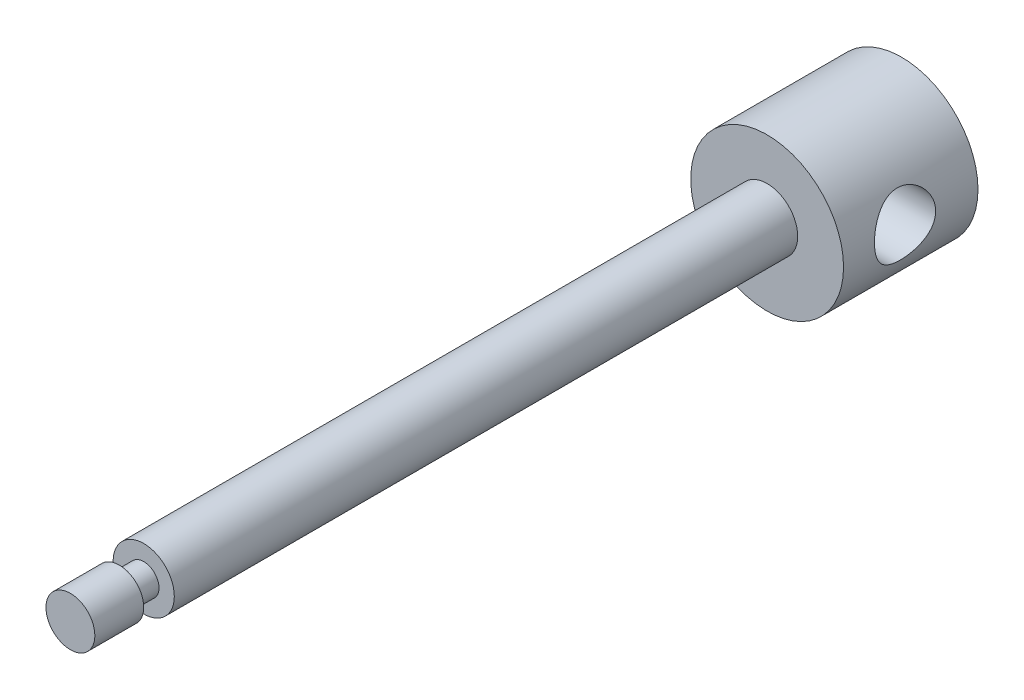
ISO-10303-21;
HEADER;
FILE_DESCRIPTION(('STEP AP214'),'2;1');
FILE_NAME('part.step','',(''),(''),'','','');
FILE_SCHEMA(('AUTOMOTIVE_DESIGN { 1 0 10303 214 1 1 1 1 }'));
ENDSEC;
DATA;
#1=APPLICATION_CONTEXT('core data for automotive mechanical design processes');
#2=APPLICATION_PROTOCOL_DEFINITION('international standard','automotive_design',2000,#1);
#3=PRODUCT_CONTEXT('',#1,'mechanical');
#4=PRODUCT('Part','Part','',(#3));
#5=PRODUCT_RELATED_PRODUCT_CATEGORY('part','',(#4));
#6=PRODUCT_DEFINITION_FORMATION('','',#4);
#7=PRODUCT_DEFINITION_CONTEXT('part definition',#1,'design');
#8=PRODUCT_DEFINITION('design','',#6,#7);
#9=PRODUCT_DEFINITION_SHAPE('','',#8);
#10=(LENGTH_UNIT() NAMED_UNIT(*) SI_UNIT(.MILLI.,.METRE.));
#11=(NAMED_UNIT(*) PLANE_ANGLE_UNIT() SI_UNIT($,.RADIAN.));
#12=(NAMED_UNIT(*) SI_UNIT($,.STERADIAN.) SOLID_ANGLE_UNIT());
#13=UNCERTAINTY_MEASURE_WITH_UNIT(LENGTH_MEASURE(1.E-05),#10,'distance_accuracy_value','');
#14=(GEOMETRIC_REPRESENTATION_CONTEXT(3) GLOBAL_UNCERTAINTY_ASSIGNED_CONTEXT((#13)) GLOBAL_UNIT_ASSIGNED_CONTEXT((#10,
#11,#12)) REPRESENTATION_CONTEXT('',''));
#15=CARTESIAN_POINT('',(0.,0.,0.));
#16=DIRECTION('',(0.,0.,1.));
#17=DIRECTION('',(1.,0.,0.));
#18=AXIS2_PLACEMENT_3D('',#15,#16,#17);
#19=CARTESIAN_POINT('',(0.,1.2144006816421,22.));
#20=DIRECTION('',(0.,0.,-1.));
#21=DIRECTION('',(-1.,0.,0.));
#22=AXIS2_PLACEMENT_3D('',#19,#20,#21);
#23=CYLINDRICAL_SURFACE('',#22,12.5);
#24=CARTESIAN_POINT('',(-12.5,1.2144006816421,16.8899728456725));
#25=CARTESIAN_POINT('',(-12.4999992543487,1.07970381947691,16.8753180214145));
#26=CARTESIAN_POINT('',(-12.4978168714077,0.945559437583658,16.8551780233001));
#27=CARTESIAN_POINT('',(-12.4892572103874,0.679420519037024,16.8040893931823));
#28=CARTESIAN_POINT('',(-12.4828772815054,0.547427394943417,16.7731339368785));
#29=CARTESIAN_POINT('',(-12.4661883417108,0.286342718644998,16.7006139648573));
#30=CARTESIAN_POINT('',(-12.4558711798495,0.157257778123743,16.659027499947));
#31=CARTESIAN_POINT('',(-12.4316887944545,-0.0968648537615797,16.5656247206657));
#32=CARTESIAN_POINT('',(-12.4178221150037,-0.221900860597329,16.5138042105606));
#33=CARTESIAN_POINT('',(-12.3870655572071,-0.466595937310872,16.4005817020329));
#34=CARTESIAN_POINT('',(-12.370187233703,-0.586273444805831,16.3392164357542));
#35=CARTESIAN_POINT('',(-12.3339006368527,-0.820031775175914,16.2072379512532));
#36=CARTESIAN_POINT('',(-12.3144914228805,-0.93411049541151,16.1366212946305));
#37=CARTESIAN_POINT('',(-12.2533474582745,-1.26675607116186,15.9117295740658));
#38=CARTESIAN_POINT('',(-12.208652474498,-1.47606182161835,15.7442594931762));
#39=CARTESIAN_POINT('',(-12.1144933895027,-1.87308263318599,15.3708612873472));
#40=CARTESIAN_POINT('',(-12.0649077458587,-2.05951851343006,15.1636113782832));
#41=CARTESIAN_POINT('',(-11.9685922328311,-2.39578346338789,14.720541004817));
#42=CARTESIAN_POINT('',(-11.9218631925961,-2.54560194212806,14.4847123039073));
#43=CARTESIAN_POINT('',(-11.8361585590568,-2.80739705581192,13.9843759736641));
#44=CARTESIAN_POINT('',(-11.797386587271,-2.91842148814866,13.7193324524758));
#45=CARTESIAN_POINT('',(-11.7345219013332,-3.09370617065158,13.172588533405));
#46=CARTESIAN_POINT('',(-11.7104214962755,-3.15799092542163,12.8908969476301));
#47=CARTESIAN_POINT('',(-11.6813484934652,-3.23506130041064,12.3344970595621));
#48=CARTESIAN_POINT('',(-11.6754501181057,-3.25034107160089,12.0601823680499));
#49=CARTESIAN_POINT('',(-11.6810000238143,-3.23580213959042,11.5129591441698));
#50=CARTESIAN_POINT('',(-11.6924454438434,-3.20599087462521,11.2400503873296));
#51=CARTESIAN_POINT('',(-11.7302972508769,-3.10449469387554,10.7139763114712));
#52=CARTESIAN_POINT('',(-11.756127122814,-3.0344202435973,10.4604543636527));
#53=CARTESIAN_POINT('',(-11.8190538505116,-2.85608377880052,9.96871057200854));
#54=CARTESIAN_POINT('',(-11.8561533123528,-2.74781293046959,9.73049228259078));
#55=CARTESIAN_POINT('',(-11.9390054613151,-2.49087859763256,9.26510561705903));
#56=CARTESIAN_POINT('',(-11.9850573309462,-2.34070287802891,9.0388282534172));
#57=CARTESIAN_POINT('',(-12.0793108517145,-2.00590599616643,8.61362354359353));
#58=CARTESIAN_POINT('',(-12.1275132279762,-1.82127314756042,8.41470551637429));
#59=CARTESIAN_POINT('',(-12.1984586063268,-1.51676546957542,8.13581426103148));
#60=CARTESIAN_POINT('',(-12.2224421582169,-1.4076630663148,8.04414393431453));
#61=CARTESIAN_POINT('',(-12.2687161072648,-1.18181882583956,7.87030240840149));
#62=CARTESIAN_POINT('',(-12.2910071336703,-1.06507985809609,7.78812767294267));
#63=CARTESIAN_POINT('',(-12.3331727535265,-0.824656134458093,7.63386944167571));
#64=CARTESIAN_POINT('',(-12.3530466273007,-0.700969325877917,7.56178895033816));
#65=CARTESIAN_POINT('',(-12.3896842776451,-0.447556158445703,7.42836578465004));
#66=CARTESIAN_POINT('',(-12.4064494664899,-0.317832575771491,7.36701823504627));
#67=CARTESIAN_POINT('',(-12.4359400513605,-0.0561667725580191,7.2568156000918));
#68=CARTESIAN_POINT('',(-12.4487469734508,0.075662006334584,7.2077131046694));
#69=CARTESIAN_POINT('',(-12.4703279443051,0.343237555846937,7.12073547773425));
#70=CARTESIAN_POINT('',(-12.4791037231353,0.478982619060347,7.08285553226539));
#71=CARTESIAN_POINT('',(-12.4922499824094,0.753368100817096,7.01866403176222));
#72=CARTESIAN_POINT('',(-12.4966212370216,0.89200800616972,6.99235044420714));
#73=CARTESIAN_POINT('',(-12.50070371425,1.17108133789882,6.95153263599886));
#74=CARTESIAN_POINT('',(-12.500415169195,1.31151467450941,6.93702782662035));
#75=CARTESIAN_POINT('',(-12.4952183282181,1.5845940124757,6.92045324196236));
#76=CARTESIAN_POINT('',(-12.4905871165559,1.71720390489807,6.91769220123804));
#77=CARTESIAN_POINT('',(-12.4771107389808,1.98205556301086,6.92269584995318));
#78=CARTESIAN_POINT('',(-12.4682641644522,2.1142971907722,6.93046405947388));
#79=CARTESIAN_POINT('',(-12.4464830956314,2.377358740916,6.95640541411579));
#80=CARTESIAN_POINT('',(-12.4335502458241,2.50817921336056,6.9745743759312));
#81=CARTESIAN_POINT('',(-12.4038157163494,2.7675945886164,7.02110156005534));
#82=CARTESIAN_POINT('',(-12.3870125719208,2.89618862894537,7.0494636423604));
#83=CARTESIAN_POINT('',(-12.3499585845912,3.14955323715043,7.1158929291709));
#84=CARTESIAN_POINT('',(-12.329727591897,3.27434119434542,7.1539048510415));
#85=CARTESIAN_POINT('',(-12.2861446035363,3.52010285733278,7.23934965307657));
#86=CARTESIAN_POINT('',(-12.2627915014273,3.64107519203788,7.2867858760237));
#87=CARTESIAN_POINT('',(-12.1887135299152,3.99717833211625,7.44265005585548));
#88=CARTESIAN_POINT('',(-12.1339419470369,4.22568072220083,7.56468266041247));
#89=CARTESIAN_POINT('',(-12.0142101164943,4.67358984016639,7.8501666895856));
#90=CARTESIAN_POINT('',(-11.9488251632607,4.89151421358886,8.01574480225269));
#91=CARTESIAN_POINT('',(-11.8162719974036,5.29745189927118,8.3800192282329));
#92=CARTESIAN_POINT('',(-11.749102860377,5.48544933891501,8.57873300236701));
#93=CARTESIAN_POINT('',(-11.6498498276669,5.74655158723661,8.90437920160379));
#94=CARTESIAN_POINT('',(-11.6161336379803,5.83208296557064,9.0210705960629));
#95=CARTESIAN_POINT('',(-11.5508863826612,5.99295080098725,9.26183773717309));
#96=CARTESIAN_POINT('',(-11.519354457925,6.06829127753823,9.38591054450194));
#97=CARTESIAN_POINT('',(-11.4594056237413,6.20817910519431,9.64074612614563));
#98=CARTESIAN_POINT('',(-11.4309892970661,6.27272443825083,9.77151014536492));
#99=CARTESIAN_POINT('',(-11.3782055857783,6.39036384690228,10.0388099837069));
#100=CARTESIAN_POINT('',(-11.353836105586,6.44346385350496,10.1753427693489));
#101=CARTESIAN_POINT('',(-11.3108428453994,6.5358034708544,10.4477807262017));
#102=CARTESIAN_POINT('',(-11.2920306029223,6.57550652854048,10.5834989100717));
#103=CARTESIAN_POINT('',(-11.2595685078235,6.64335403538527,10.8583385391385));
#104=CARTESIAN_POINT('',(-11.2459161398122,6.67150411708612,10.9974582907947));
#105=CARTESIAN_POINT('',(-11.2242671202821,6.71589497837488,11.2779562457106));
#106=CARTESIAN_POINT('',(-11.2162677919505,6.73214139469014,11.419333347601));
#107=CARTESIAN_POINT('',(-11.2062210068887,6.7525179666537,11.7031643684367));
#108=CARTESIAN_POINT('',(-11.204173050475,6.75664913951073,11.845618195972));
#109=CARTESIAN_POINT('',(-11.2060131883828,6.75292629893702,12.1167826639825));
#110=CARTESIAN_POINT('',(-11.2093560328515,6.74617320636217,12.245513722803));
#111=CARTESIAN_POINT('',(-11.2208715130098,6.72277726129724,12.5018972970816));
#112=CARTESIAN_POINT('',(-11.2290457135234,6.70613120457336,12.6295494495003));
#113=CARTESIAN_POINT('',(-11.2499710700156,6.66313653110201,12.8827919332984));
#114=CARTESIAN_POINT('',(-11.2627209153494,6.63679069269831,13.0083828443369));
#115=CARTESIAN_POINT('',(-11.2924123975521,6.57468015605077,13.2567236470473));
#116=CARTESIAN_POINT('',(-11.3093556544143,6.53891181737425,13.3794724206601));
#117=CARTESIAN_POINT('',(-11.3656697377529,6.41819658812702,13.7415613925073));
#118=CARTESIAN_POINT('',(-11.4106069709424,6.31967944875109,13.9756713070359));
#119=CARTESIAN_POINT('',(-11.5107631679711,6.08964248676201,14.4245095177794));
#120=CARTESIAN_POINT('',(-11.5659857952915,5.95811089914709,14.6392308675315));
#121=CARTESIAN_POINT('',(-11.6871314119825,5.65179856918345,15.0643003572665));
#122=CARTESIAN_POINT('',(-11.7535712521219,5.47415829523888,15.2724427776235));
#123=CARTESIAN_POINT('',(-11.886661755219,5.08725539508547,15.657158715936));
#124=CARTESIAN_POINT('',(-11.9533124906895,4.87798038441085,15.8337198109721));
#125=CARTESIAN_POINT('',(-12.0508378635437,4.53741533361023,16.0762335856991));
#126=CARTESIAN_POINT('',(-12.0837931073236,4.4157498438248,16.1551471848449));
#127=CARTESIAN_POINT('',(-12.1473134897558,4.16556914281089,16.3023363515692));
#128=CARTESIAN_POINT('',(-12.1778795042438,4.03705647092637,16.3706158265651));
#129=CARTESIAN_POINT('',(-12.2358832454385,3.77395525683058,16.4959528212205));
#130=CARTESIAN_POINT('',(-12.2633201755324,3.6393651795329,16.5530074858988));
#131=CARTESIAN_POINT('',(-12.3143838435361,3.36507440756776,16.6552924725041));
#132=CARTESIAN_POINT('',(-12.3380112012889,3.22537454884345,16.7005247187636));
#133=CARTESIAN_POINT('',(-12.3785361188751,2.95742900656175,16.7743722395583));
#134=CARTESIAN_POINT('',(-12.3958871425897,2.82960227217327,16.8042640752916));
#135=CARTESIAN_POINT('',(-12.426786048631,2.57155432622166,16.8539514071794));
#136=CARTESIAN_POINT('',(-12.4403343631468,2.44133338856071,16.8737480508914));
#137=CARTESIAN_POINT('',(-12.4633633425991,2.17969074355755,16.9029819879688));
#138=CARTESIAN_POINT('',(-12.4728533991007,2.04827253532134,16.9124432790827));
#139=CARTESIAN_POINT('',(-12.4876692430858,1.78491817806998,16.9209467223213));
#140=CARTESIAN_POINT('',(-12.4929974331203,1.65298237213158,16.9199948904751));
#141=CARTESIAN_POINT('',(-12.4974911953075,1.47003378148705,16.9114288898009));
#142=CARTESIAN_POINT('',(-12.4984330375188,1.41882318358662,16.9082399431856));
#143=CARTESIAN_POINT('',(-12.4996875889031,1.31651552964094,16.900287271943));
#144=CARTESIAN_POINT('',(-12.5000002824229,1.26541847645229,16.8955235081375));
#145=CARTESIAN_POINT('',(-12.5,1.2144006816421,16.8899728456725));
#146=B_SPLINE_CURVE_WITH_KNOTS('',3,(#24,#25,#26,#27,#28,#29,#30,#31,#32,#33,#34,#35,#36,#37,
#38,#39,#40,#41,#42,#43,#44,#45,#46,#47,#48,#49,#50,#51,#52,#53,#54,#55,#56,#57,#58,#59,#60,#61,
#62,#63,#64,#65,#66,#67,#68,#69,#70,#71,#72,#73,#74,#75,#76,#77,#78,#79,#80,#81,#82,#83,#84,#85,
#86,#87,#88,#89,#90,#91,#92,#93,#94,#95,#96,#97,#98,#99,#100,#101,#102,#103,#104,#105,#106,#107,
#108,#109,#110,#111,#112,#113,#114,#115,#116,#117,#118,#119,#120,#121,#122,#123,#124,#125,#126,
#127,#128,#129,#130,#131,#132,#133,#134,#135,#136,#137,#138,#139,#140,#141,#142,#143,#144,#145),
.UNSPECIFIED.,.T.,.F.,(4,2,2,2,2,2,2,2,2,2,2,2,2,2,2,2,2,2,2,2,2,2,2,2,2,2,2,2,2,2,2,2,2,2,2,2,
2,2,2,2,2,2,2,2,2,2,2,2,2,2,2,2,2,2,2,2,2,2,2,2,4),(0.,0.406423435355154,0.813103778875251,
1.22063064905826,1.62832494446945,2.03448740797631,2.44080125761473,3.25234378158454,
4.09803645878902,4.94397344982417,5.80941588922945,6.67440426802488,7.49460578545202,
8.31467201686146,9.10401771493426,9.89354608750817,10.7164046558544,11.539542810593,
11.9726242978051,12.4055439773349,12.8385922392975,13.2714432829638,13.6946712106777,
14.1177173294081,14.5406890777863,14.9636397376642,15.3613169126744,15.7591270697353,
16.1567773351473,16.5545783442597,16.9501499009315,17.3458620174301,18.1367111850833,
18.9774339651372,19.8186011718127,20.2638179297597,20.7088585712481,21.1539823160513,
21.5988748386576,22.0262488170206,22.4534141850841,22.8803771471222,23.3073042598699,
23.6936880865893,24.0801971274852,24.4665955452116,24.8531434695128,25.6234400447818,
26.3940115130055,27.2352290272621,28.0767767209724,28.5224525252572,28.9679641814754,
29.4135890055459,29.8591412501238,30.25594873332,30.6527110998967,31.0485502492354,
31.444160720398,31.5980938650186,31.7520308394789),.UNSPECIFIED.);
#147=CARTESIAN_POINT('',(-12.5,1.2144006816421,16.8899728456725));
#148=VERTEX_POINT('',#147);
#149=EDGE_CURVE('E41',#148,#148,#146,.T.);
#150=ORIENTED_EDGE('',*,*,#149,.T.);
#151=EDGE_LOOP('',(#150));
#152=FACE_BOUND('',#151,.T.);
#153=CARTESIAN_POINT('',(12.4882974222638,1.7551663361349,6.9193016126376));
#154=CARTESIAN_POINT('',(12.4940652354247,1.62195121073904,6.91930243266469));
#155=CARTESIAN_POINT('',(12.4976990307337,1.4885964540023,6.92463258986796));
#156=CARTESIAN_POINT('',(12.5007055938109,1.22263410064651,6.94594997817126));
#157=CARTESIAN_POINT('',(12.5000756701308,1.09002702885967,6.9619439349911));
#158=CARTESIAN_POINT('',(12.4946717403359,0.826327288333316,7.00451499127572));
#159=CARTESIAN_POINT('',(12.4898893427226,0.695238231178434,7.03111346189774));
#160=CARTESIAN_POINT('',(12.4764018386782,0.435755498710123,7.09467625729459));
#161=CARTESIAN_POINT('',(12.4676951592624,0.307362925858204,7.13164473647286));
#162=CARTESIAN_POINT('',(12.446723227668,0.0546155956162062,7.21549567340463));
#163=CARTESIAN_POINT('',(12.4344695759177,-0.0697508780792067,7.2623456800584));
#164=CARTESIAN_POINT('',(12.4068079455281,-0.314085511472332,7.3656415322288));
#165=CARTESIAN_POINT('',(12.3913987860661,-0.434052004779879,7.42209096860348));
#166=CARTESIAN_POINT('',(12.3411591434345,-0.786036544456725,7.60513210572609));
#167=CARTESIAN_POINT('',(12.3022855392937,-1.01048739788901,7.74553278085127));
#168=CARTESIAN_POINT('',(12.2167200044027,-1.44112493442242,8.06466400083339));
#169=CARTESIAN_POINT('',(12.1697994288769,-1.64637980287992,8.24457879070899));
#170=CARTESIAN_POINT('',(12.0745384133388,-2.02498953686385,8.63534955227735));
#171=CARTESIAN_POINT('',(12.0261973670821,-2.19833054562021,8.84621889313052));
#172=CARTESIAN_POINT('',(11.9557992201704,-2.43471916240249,9.18704079631153));
#173=CARTESIAN_POINT('',(11.9321860384601,-2.51098553758748,9.30771872341722));
#174=CARTESIAN_POINT('',(11.8868987845112,-2.65305171213698,9.55541402369485));
#175=CARTESIAN_POINT('',(11.8652239606336,-2.71885557632736,9.68242890955156));
#176=CARTESIAN_POINT('',(11.8245543271225,-2.83948301933942,9.94200756076491));
#177=CARTESIAN_POINT('',(11.8055600174979,-2.89430455037279,10.074572355408));
#178=CARTESIAN_POINT('',(11.7709452573223,-2.9924457234333,10.3442601006669));
#179=CARTESIAN_POINT('',(11.755323244008,-3.03577069524957,10.4813809058299));
#180=CARTESIAN_POINT('',(11.7284197045606,-3.10944790436508,10.7552333553279));
#181=CARTESIAN_POINT('',(11.7170266391185,-3.14013627047509,10.8918635815603));
#182=CARTESIAN_POINT('',(11.6983886313479,-3.18996228094897,11.167438281617));
#183=CARTESIAN_POINT('',(11.6911419209646,-3.20910484876639,11.3063817430019));
#184=CARTESIAN_POINT('',(11.6810638037869,-3.23564998372633,11.5855257693443));
#185=CARTESIAN_POINT('',(11.6782317553665,-3.24305425691281,11.7257261486421));
#186=CARTESIAN_POINT('',(11.6770899582343,-3.24604478615657,12.0062685853188));
#187=CARTESIAN_POINT('',(11.6787800315598,-3.24163150727982,12.1466106369049));
#188=CARTESIAN_POINT('',(11.6863935954048,-3.22162326321861,12.4183646187538));
#189=CARTESIAN_POINT('',(11.6920716578691,-3.20667638199164,12.5498317659202));
#190=CARTESIAN_POINT('',(11.7072022073992,-3.16645287147371,12.8110002083074));
#191=CARTESIAN_POINT('',(11.7166559553442,-3.14117279137456,12.9407008986475));
#192=CARTESIAN_POINT('',(11.7390227662512,-3.0805250049561,13.1973768228361));
#193=CARTESIAN_POINT('',(11.751934930797,-3.0451599183325,13.3243527552734));
#194=CARTESIAN_POINT('',(11.7808120760776,-2.96462973299104,13.574850239192));
#195=CARTESIAN_POINT('',(11.7967782230501,-2.91946088957835,13.6983704502995));
#196=CARTESIAN_POINT('',(11.8315197312626,-2.81896104021576,13.9429347065845));
#197=CARTESIAN_POINT('',(11.850332618762,-2.76349161539786,14.0639164904391));
#198=CARTESIAN_POINT('',(11.8900248905108,-2.64323031799219,14.3008481507096));
#199=CARTESIAN_POINT('',(11.9109049758151,-2.57843527937844,14.4167963007458));
#200=CARTESIAN_POINT('',(11.9541161601996,-2.439961903066,14.6429913749809));
#201=CARTESIAN_POINT('',(11.9764474168129,-2.36628260018375,14.7532376778704));
#202=CARTESIAN_POINT('',(12.021924841086,-2.21049445465227,14.9674277930692));
#203=CARTESIAN_POINT('',(12.045071040251,-2.12838528587342,15.0713713612944));
#204=CARTESIAN_POINT('',(12.092956986451,-1.9509338478632,15.2785489951234));
#205=CARTESIAN_POINT('',(12.1177076287592,-1.85508940958556,15.3813510061459));
#206=CARTESIAN_POINT('',(12.1666292327847,-1.65504711180074,15.578559142895));
#207=CARTESIAN_POINT('',(12.1908003750925,-1.55085189979603,15.672967909724));
#208=CARTESIAN_POINT('',(12.2378344951904,-1.33464804328858,15.8528536134856));
#209=CARTESIAN_POINT('',(12.2606968276218,-1.22263560358996,15.9383261609475));
#210=CARTESIAN_POINT('',(12.3043694810687,-0.99157038336504,16.0996463780614));
#211=CARTESIAN_POINT('',(12.3251806447171,-0.872520526279004,16.1754980037533));
#212=CARTESIAN_POINT('',(12.3642324294611,-0.627148921356781,16.3175768933843));
#213=CARTESIAN_POINT('',(12.3824520052173,-0.500778204069616,16.3837254843003));
#214=CARTESIAN_POINT('',(12.4154861501962,-0.242527499930811,16.5051020790013));
#215=CARTESIAN_POINT('',(12.4303021248316,-0.110649813693111,16.5603345889269));
#216=CARTESIAN_POINT('',(12.4559818361592,0.157672292144689,16.6593923699205));
#217=CARTESIAN_POINT('',(12.4668463160535,0.294115847713104,16.7032197856314));
#218=CARTESIAN_POINT('',(12.4841735596596,0.570522108965805,16.7790497275402));
#219=CARTESIAN_POINT('',(12.4906365937119,0.710484597966501,16.8110529799331));
#220=CARTESIAN_POINT('',(12.4985970822617,0.984650771240107,16.8614267252694));
#221=CARTESIAN_POINT('',(12.5003588156093,1.11872252614179,16.8804755891239));
#222=CARTESIAN_POINT('',(12.4995197343508,1.38800500502177,16.9076390172132));
#223=CARTESIAN_POINT('',(12.4969174391073,1.52321610007068,16.9157498686897));
#224=CARTESIAN_POINT('',(12.487305465228,1.79362010028581,16.9209811373707));
#225=CARTESIAN_POINT('',(12.4802981565175,1.92881297615984,16.9181074601005));
#226=CARTESIAN_POINT('',(12.4619514289871,2.1982774141354,16.9014581396881));
#227=CARTESIAN_POINT('',(12.4506104017716,2.33254861531443,16.887678446903));
#228=CARTESIAN_POINT('',(12.4242250572765,2.59476843085243,16.8500244892939));
#229=CARTESIAN_POINT('',(12.4093141807058,2.72278009901118,16.8264955864422));
#230=CARTESIAN_POINT('',(12.3758879584281,2.97615198792651,16.7696704810308));
#231=CARTESIAN_POINT('',(12.3573713442564,3.10151125833842,16.7363708391213));
#232=CARTESIAN_POINT('',(12.296915956737,3.47235367476078,16.6222822413279));
#233=CARTESIAN_POINT('',(12.2500486917798,3.71282174199998,16.5272714171469));
#234=CARTESIAN_POINT('',(12.144534666356,4.18447305077561,16.297693473682));
#235=CARTESIAN_POINT('',(12.0854673865046,4.41480986929465,16.1615984403079));
#236=CARTESIAN_POINT('',(11.9617444837456,4.85004308071272,15.8553601437062));
#237=CARTESIAN_POINT('',(11.8970862788492,5.05492761171491,15.6852011008903));
#238=CARTESIAN_POINT('',(11.7629355457452,5.44874696755625,15.3013764243025));
#239=CARTESIAN_POINT('',(11.6934277965702,5.63549515501711,15.0854704682457));
#240=CARTESIAN_POINT('',(11.5612300001579,5.97050027024232,14.6234176348034));
#241=CARTESIAN_POINT('',(11.4985409968896,6.11875130879222,14.3772661389924));
#242=CARTESIAN_POINT('',(11.4150772137053,6.30859321034287,13.9898375784983));
#243=CARTESIAN_POINT('',(11.3889907146052,6.36650513320709,13.8574782210314));
#244=CARTESIAN_POINT('',(11.3412043593265,6.47086154437735,13.587568778261));
#245=CARTESIAN_POINT('',(11.3195024775914,6.51731133003906,13.4500211248002));
#246=CARTESIAN_POINT('',(11.2812630291705,6.59818262282574,13.1708252192045));
#247=CARTESIAN_POINT('',(11.2647224100963,6.6326112407499,13.0291794450862));
#248=CARTESIAN_POINT('',(11.2374128702391,6.68902757797117,12.7428848485239));
#249=CARTESIAN_POINT('',(11.2266433105222,6.71101667450567,12.5982363603635));
#250=CARTESIAN_POINT('',(11.2120054439917,6.74080811718456,12.3206045917894));
#251=CARTESIAN_POINT('',(11.2075946611723,6.74972687846913,12.1877685220876));
#252=CARTESIAN_POINT('',(11.2040316156488,6.75693563405814,11.9217400835885));
#253=CARTESIAN_POINT('',(11.2048790681656,6.75522620397099,11.7885477344772));
#254=CARTESIAN_POINT('',(11.2118035021262,6.74120103585415,11.5228787767442));
#255=CARTESIAN_POINT('',(11.2178798408821,6.72888660129643,11.3904020821742));
#256=CARTESIAN_POINT('',(11.2350563799415,6.69380647816006,11.1271745884728));
#257=CARTESIAN_POINT('',(11.2461565608006,6.67104083003216,10.9964237826635));
#258=CARTESIAN_POINT('',(11.2723745963126,6.61666273304888,10.7438326423985));
#259=CARTESIAN_POINT('',(11.2872734433873,6.58552865103364,10.6218662754674));
#260=CARTESIAN_POINT('',(11.3208759184954,6.51433556596762,10.381091562078));
#261=CARTESIAN_POINT('',(11.339580769886,6.4742736928775,10.2622842449458));
#262=CARTESIAN_POINT('',(11.4006759692416,6.34120940046765,9.91166424474074));
#263=CARTESIAN_POINT('',(11.4480656917875,6.23529121678301,9.68548336345662));
#264=CARTESIAN_POINT('',(11.5552251033166,5.9837442508374,9.23795931708928));
#265=CARTESIAN_POINT('',(11.6156256896536,5.8358698067235,9.01804109351297));
#266=CARTESIAN_POINT('',(11.7407431719839,5.50808907753285,8.6049124940462));
#267=CARTESIAN_POINT('',(11.8054617171155,5.32817050968526,8.41171241005948));
#268=CARTESIAN_POINT('',(11.9391467691603,4.92327969363373,8.04056483293176));
#269=CARTESIAN_POINT('',(12.0080075388799,4.69577946398721,7.86530414017407));
#270=CARTESIAN_POINT('',(12.1052384717848,4.3335308133857,7.63296026482992));
#271=CARTESIAN_POINT('',(12.1366633757443,4.20916448649017,7.5605539706015));
#272=CARTESIAN_POINT('',(12.1967583810035,3.95414519461703,7.42650673460965));
#273=CARTESIAN_POINT('',(12.2254297191869,3.8234950922269,7.36486094902618));
#274=CARTESIAN_POINT('',(12.2791457838579,3.55765724290792,7.25328914223524));
#275=CARTESIAN_POINT('',(12.3042139605161,3.42250661776203,7.20328589055776));
#276=CARTESIAN_POINT('',(12.3503540046084,3.14782567822553,7.11500209233434));
#277=CARTESIAN_POINT('',(12.3714277614493,3.00829747106754,7.07671599814315));
#278=CARTESIAN_POINT('',(12.409050314828,2.72624231542743,7.01237940126605));
#279=CARTESIAN_POINT('',(12.4256107328737,2.58372410609886,6.98629734739189));
#280=CARTESIAN_POINT('',(12.4539032694444,2.29656314281285,6.94658911982056));
#281=CARTESIAN_POINT('',(12.4656390954093,2.15192210899414,6.93295337193514));
#282=CARTESIAN_POINT('',(12.4775162700425,1.96497129991545,6.92352893665607));
#283=CARTESIAN_POINT('',(12.4799675840648,1.92304339600282,6.92194444991921));
#284=CARTESIAN_POINT('',(12.4844490960724,1.83913706583939,6.9198306438492));
#285=CARTESIAN_POINT('',(12.4864792822305,1.79715863820295,6.91930135414724));
#286=CARTESIAN_POINT('',(12.4882974222638,1.7551663361349,6.9193016126376));
#287=B_SPLINE_CURVE_WITH_KNOTS('',3,(#153,#154,#155,#156,#157,#158,#159,#160,#161,#162,#163,
#164,#165,#166,#167,#168,#169,#170,#171,#172,#173,#174,#175,#176,#177,#178,#179,#180,#181,#182,
#183,#184,#185,#186,#187,#188,#189,#190,#191,#192,#193,#194,#195,#196,#197,#198,#199,#200,#201,
#202,#203,#204,#205,#206,#207,#208,#209,#210,#211,#212,#213,#214,#215,#216,#217,#218,#219,#220,
#221,#222,#223,#224,#225,#226,#227,#228,#229,#230,#231,#232,#233,#234,#235,#236,#237,#238,#239,
#240,#241,#242,#243,#244,#245,#246,#247,#248,#249,#250,#251,#252,#253,#254,#255,#256,#257,#258,
#259,#260,#261,#262,#263,#264,#265,#266,#267,#268,#269,#270,#271,#272,#273,#274,#275,#276,#277,
#278,#279,#280,#281,#282,#283,#284,#285,#286),.UNSPECIFIED.,.T.,.F.,(4,2,2,2,2,2,2,2,2,2,2,2,2,
2,2,2,2,2,2,2,2,2,2,2,2,2,2,2,2,2,2,2,2,2,2,2,2,2,2,2,2,2,2,2,2,2,2,2,2,2,2,2,2,2,2,2,2,2,2,2,2,
2,2,2,2,2,4),(0.,0.399977482344136,0.800207471724694,1.20124815051859,1.60244972311443,
2.00235370516016,2.40240760965408,3.20142476478533,4.0288204006149,4.85657444283092,
5.29022715650114,5.72371097639965,6.15727554949811,6.59063877009396,7.0115852223212,
7.43235204398283,7.85305770577864,8.27374681143719,8.67058665705351,9.06755913715242,
9.46442859289702,9.86144990661271,10.2642533445188,10.6671938573282,11.0701781849704,
11.4731781089084,11.9008211771164,12.3283291990229,12.7560462359113,13.1835868251275,
13.6144221782704,14.0450793100951,14.4756554014405,14.9062050440421,15.3119851893686,
15.7179030365575,16.123602684042,16.5294530474211,16.9220123592049,17.3147100199704,
18.0994417756841,18.9179837327435,19.7369057468891,20.6143591895729,21.4919467843027,
21.9318796171049,22.3716087475924,22.8110773256923,23.2504972386501,23.6496052924958,
24.0486917313795,24.4477291251395,24.8467649744638,25.2266012379023,25.6065597848532,
26.3659573820334,27.1780537235371,27.9904620206845,28.8718313950986,29.313282874154,
29.7545351194083,30.1927711702539,30.6307994102213,31.0676888690418,31.5042419713782,
31.6303200242865,31.7564016175674),.UNSPECIFIED.);
#288=CARTESIAN_POINT('',(12.4882974222638,1.7551663361349,6.9193016126376));
#289=VERTEX_POINT('',#288);
#290=EDGE_CURVE('E65',#289,#289,#287,.T.);
#291=ORIENTED_EDGE('',*,*,#290,.T.);
#292=EDGE_LOOP('',(#291));
#293=FACE_BOUND('',#292,.T.);
#294=CARTESIAN_POINT('',(0.,1.2144006816421,22.));
#295=DIRECTION('',(0.,0.,1.));
#296=DIRECTION('',(1.,0.,0.));
#297=AXIS2_PLACEMENT_3D('',#294,#295,#296);
#298=CIRCLE('',#297,12.5);
#299=CARTESIAN_POINT('',(12.5,1.2144006816421,22.));
#300=VERTEX_POINT('',#299);
#301=EDGE_CURVE('E56',#300,#300,#298,.T.);
#302=ORIENTED_EDGE('',*,*,#301,.F.);
#303=EDGE_LOOP('',(#302));
#304=FACE_BOUND('',#303,.T.);
#305=CARTESIAN_POINT('',(0.,1.2144006816421,0.));
#306=DIRECTION('',(0.,0.,1.));
#307=DIRECTION('',(1.,0.,0.));
#308=AXIS2_PLACEMENT_3D('',#305,#306,#307);
#309=CIRCLE('',#308,12.5);
#310=CARTESIAN_POINT('',(12.5,1.2144006816421,0.));
#311=VERTEX_POINT('',#310);
#312=EDGE_CURVE('E70',#311,#311,#309,.T.);
#313=ORIENTED_EDGE('',*,*,#312,.T.);
#314=EDGE_LOOP('',(#313));
#315=FACE_BOUND('',#314,.T.);
#316=ADVANCED_FACE('F37',(#152,#293,#304,#315),#23,.T.);
#317=CARTESIAN_POINT('',(0.,1.2144006816421,22.));
#318=DIRECTION('',(0.,0.,1.));
#319=DIRECTION('',(1.,0.,0.));
#320=AXIS2_PLACEMENT_3D('',#317,#318,#319);
#321=PLANE('',#320);
#322=CARTESIAN_POINT('',(0.,1.80527280656406,22.));
#323=DIRECTION('',(0.,0.,1.));
#324=DIRECTION('',(1.,0.,0.));
#325=AXIS2_PLACEMENT_3D('',#322,#323,#324);
#326=CIRCLE('',#325,5.);
#327=CARTESIAN_POINT('',(5.,1.80527280656406,22.));
#328=VERTEX_POINT('',#327);
#329=EDGE_CURVE('E50',#328,#328,#326,.T.);
#330=ORIENTED_EDGE('',*,*,#329,.F.);
#331=EDGE_LOOP('',(#330));
#332=FACE_BOUND('',#331,.T.);
#333=ORIENTED_EDGE('',*,*,#301,.T.);
#334=EDGE_LOOP('',(#333));
#335=FACE_BOUND('',#334,.T.);
#336=ADVANCED_FACE('F87',(#332,#335),#321,.T.);
#337=CARTESIAN_POINT('',(0.,1.2144006816421,0.));
#338=DIRECTION('',(0.,0.,1.));
#339=DIRECTION('',(1.,0.,0.));
#340=AXIS2_PLACEMENT_3D('',#337,#338,#339);
#341=PLANE('',#340);
#342=ORIENTED_EDGE('',*,*,#312,.F.);
#343=EDGE_LOOP('',(#342));
#344=FACE_BOUND('',#343,.T.);
#345=ADVANCED_FACE('F84',(#344),#341,.F.);
#346=CARTESIAN_POINT('',(-24.,1.7551663361349,11.9193016126376));
#347=DIRECTION('',(1.,0.,0.));
#348=DIRECTION('',(0.,0.,-1.));
#349=AXIS2_PLACEMENT_3D('',#346,#347,#348);
#350=CYLINDRICAL_SURFACE('',#349,5.);
#351=ORIENTED_EDGE('',*,*,#290,.F.);
#352=EDGE_LOOP('',(#351));
#353=FACE_BOUND('',#352,.T.);
#354=ORIENTED_EDGE('',*,*,#149,.F.);
#355=EDGE_LOOP('',(#354));
#356=FACE_BOUND('',#355,.T.);
#357=ADVANCED_FACE('F78',(#353,#356),#350,.F.);
#358=CARTESIAN_POINT('',(0.,1.80527280656406,124.));
#359=DIRECTION('',(0.,0.,-1.));
#360=DIRECTION('',(-1.,0.,0.));
#361=AXIS2_PLACEMENT_3D('',#358,#359,#360);
#362=CYLINDRICAL_SURFACE('',#361,5.);
#363=CARTESIAN_POINT('',(0.,1.80527280656406,124.));
#364=DIRECTION('',(0.,0.,1.));
#365=DIRECTION('',(1.,0.,0.));
#366=AXIS2_PLACEMENT_3D('',#363,#364,#365);
#367=CIRCLE('',#366,5.);
#368=CARTESIAN_POINT('',(5.,1.80527280656406,124.));
#369=VERTEX_POINT('',#368);
#370=EDGE_CURVE('E62',#369,#369,#367,.T.);
#371=ORIENTED_EDGE('',*,*,#370,.F.);
#372=EDGE_LOOP('',(#371));
#373=FACE_BOUND('',#372,.T.);
#374=ORIENTED_EDGE('',*,*,#329,.T.);
#375=EDGE_LOOP('',(#374));
#376=FACE_BOUND('',#375,.T.);
#377=ADVANCED_FACE('F83',(#373,#376),#362,.T.);
#378=CARTESIAN_POINT('',(0.,1.80527280656406,124.));
#379=DIRECTION('',(0.,0.,1.));
#380=DIRECTION('',(1.,0.,0.));
#381=AXIS2_PLACEMENT_3D('',#378,#379,#380);
#382=PLANE('',#381);
#383=CARTESIAN_POINT('',(0.,1.74135250990354,124.));
#384=DIRECTION('',(0.,0.,1.));
#385=DIRECTION('',(1.,0.,0.));
#386=AXIS2_PLACEMENT_3D('',#383,#384,#385);
#387=CIRCLE('',#386,2.5);
#388=CARTESIAN_POINT('',(2.50000000000001,1.74135250990354,124.));
#389=VERTEX_POINT('',#388);
#390=EDGE_CURVE('E10',#389,#389,#387,.T.);
#391=ORIENTED_EDGE('',*,*,#390,.F.);
#392=EDGE_LOOP('',(#391));
#393=FACE_BOUND('',#392,.T.);
#394=ORIENTED_EDGE('',*,*,#370,.T.);
#395=EDGE_LOOP('',(#394));
#396=FACE_BOUND('',#395,.T.);
#397=ADVANCED_FACE('F139',(#393,#396),#382,.T.);
#398=CARTESIAN_POINT('',(0.,1.74135250990354,128.));
#399=DIRECTION('',(0.,0.,-1.));
#400=DIRECTION('',(-1.,0.,0.));
#401=AXIS2_PLACEMENT_3D('',#398,#399,#400);
#402=CYLINDRICAL_SURFACE('',#401,2.5);
#403=CARTESIAN_POINT('',(0.,1.74135250990354,128.));
#404=DIRECTION('',(0.,0.,1.));
#405=DIRECTION('',(1.,0.,0.));
#406=AXIS2_PLACEMENT_3D('',#403,#404,#405);
#407=CIRCLE('',#406,2.5);
#408=CARTESIAN_POINT('',(2.50000000000001,1.74135250990354,128.));
#409=VERTEX_POINT('',#408);
#410=EDGE_CURVE('E60',#409,#409,#407,.T.);
#411=ORIENTED_EDGE('',*,*,#410,.F.);
#412=EDGE_LOOP('',(#411));
#413=FACE_BOUND('',#412,.T.);
#414=ORIENTED_EDGE('',*,*,#390,.T.);
#415=EDGE_LOOP('',(#414));
#416=FACE_BOUND('',#415,.T.);
#417=ADVANCED_FACE('F136',(#413,#416),#402,.T.);
#418=CARTESIAN_POINT('',(0.,1.74135250990354,136.));
#419=DIRECTION('',(0.,0.,-1.));
#420=DIRECTION('',(-1.,0.,0.));
#421=AXIS2_PLACEMENT_3D('',#418,#419,#420);
#422=CYLINDRICAL_SURFACE('',#421,4.);
#423=CARTESIAN_POINT('',(0.,1.74135250990354,136.));
#424=DIRECTION('',(0.,0.,1.));
#425=DIRECTION('',(1.,0.,0.));
#426=AXIS2_PLACEMENT_3D('',#423,#424,#425);
#427=CIRCLE('',#426,4.);
#428=CARTESIAN_POINT('',(4.00000000000001,1.74135250990354,136.));
#429=VERTEX_POINT('',#428);
#430=EDGE_CURVE('E113',#429,#429,#427,.T.);
#431=ORIENTED_EDGE('',*,*,#430,.F.);
#432=EDGE_LOOP('',(#431));
#433=FACE_BOUND('',#432,.T.);
#434=CARTESIAN_POINT('',(0.,1.74135250990354,128.));
#435=DIRECTION('',(0.,0.,1.));
#436=DIRECTION('',(1.,0.,0.));
#437=AXIS2_PLACEMENT_3D('',#434,#435,#436);
#438=CIRCLE('',#437,4.);
#439=CARTESIAN_POINT('',(4.00000000000001,1.74135250990354,128.));
#440=VERTEX_POINT('',#439);
#441=EDGE_CURVE('E116',#440,#440,#438,.T.);
#442=ORIENTED_EDGE('',*,*,#441,.T.);
#443=EDGE_LOOP('',(#442));
#444=FACE_BOUND('',#443,.T.);
#445=ADVANCED_FACE('F121',(#433,#444),#422,.T.);
#446=CARTESIAN_POINT('',(0.,1.74135250990354,136.));
#447=DIRECTION('',(0.,0.,1.));
#448=DIRECTION('',(1.,0.,0.));
#449=AXIS2_PLACEMENT_3D('',#446,#447,#448);
#450=PLANE('',#449);
#451=ORIENTED_EDGE('',*,*,#430,.T.);
#452=EDGE_LOOP('',(#451));
#453=FACE_BOUND('',#452,.T.);
#454=ADVANCED_FACE('F125',(#453),#450,.T.);
#455=CARTESIAN_POINT('',(0.,1.74135250990354,128.));
#456=DIRECTION('',(0.,0.,1.));
#457=DIRECTION('',(1.,0.,0.));
#458=AXIS2_PLACEMENT_3D('',#455,#456,#457);
#459=PLANE('',#458);
#460=ORIENTED_EDGE('',*,*,#410,.T.);
#461=EDGE_LOOP('',(#460));
#462=FACE_BOUND('',#461,.T.);
#463=ORIENTED_EDGE('',*,*,#441,.F.);
#464=EDGE_LOOP('',(#463));
#465=FACE_BOUND('',#464,.T.);
#466=ADVANCED_FACE('F123',(#462,#465),#459,.F.);
#467=CLOSED_SHELL('',(#316,#336,#345,#357,#377,#397,#417,#445,#454,#466));
#468=MANIFOLD_SOLID_BREP('B2',#467);
#469=ADVANCED_BREP_SHAPE_REPRESENTATION('',(#18,#468),#14);
#470=SHAPE_DEFINITION_REPRESENTATION(#9,#469);
ENDSEC;
END-ISO-10303-21;
